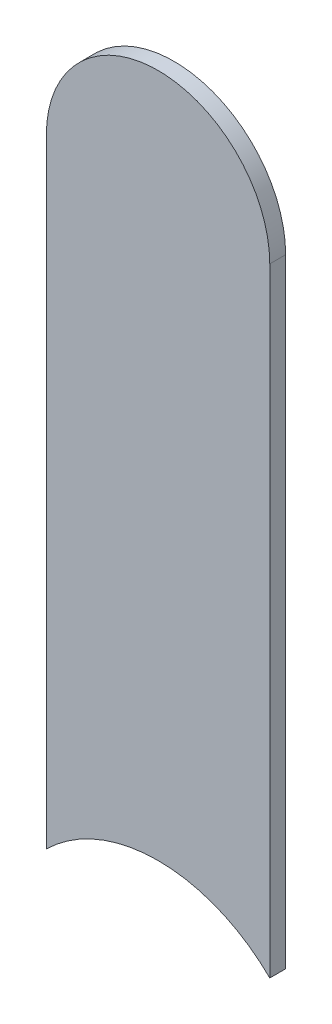
ISO-10303-21;
HEADER;
FILE_DESCRIPTION(('STEP AP214'),'2;1');
FILE_NAME('part.step','',(''),(''),'','','');
FILE_SCHEMA(('AUTOMOTIVE_DESIGN { 1 0 10303 214 1 1 1 1 }'));
ENDSEC;
DATA;
#1=APPLICATION_CONTEXT('core data for automotive mechanical design processes');
#2=APPLICATION_PROTOCOL_DEFINITION('international standard','automotive_design',2000,#1);
#3=PRODUCT_CONTEXT('',#1,'mechanical');
#4=PRODUCT('Part','Part','',(#3));
#5=PRODUCT_RELATED_PRODUCT_CATEGORY('part','',(#4));
#6=PRODUCT_DEFINITION_FORMATION('','',#4);
#7=PRODUCT_DEFINITION_CONTEXT('part definition',#1,'design');
#8=PRODUCT_DEFINITION('design','',#6,#7);
#9=PRODUCT_DEFINITION_SHAPE('','',#8);
#10=(LENGTH_UNIT() NAMED_UNIT(*) SI_UNIT(.MILLI.,.METRE.));
#11=(NAMED_UNIT(*) PLANE_ANGLE_UNIT() SI_UNIT($,.RADIAN.));
#12=(NAMED_UNIT(*) SI_UNIT($,.STERADIAN.) SOLID_ANGLE_UNIT());
#13=UNCERTAINTY_MEASURE_WITH_UNIT(LENGTH_MEASURE(1.E-05),#10,'distance_accuracy_value','');
#14=(GEOMETRIC_REPRESENTATION_CONTEXT(3) GLOBAL_UNCERTAINTY_ASSIGNED_CONTEXT((#13)) GLOBAL_UNIT_ASSIGNED_CONTEXT((#10,
#11,#12)) REPRESENTATION_CONTEXT('',''));
#15=CARTESIAN_POINT('',(0.,0.,0.));
#16=DIRECTION('',(0.,0.,1.));
#17=DIRECTION('',(1.,0.,0.));
#18=AXIS2_PLACEMENT_3D('',#15,#16,#17);
#19=CARTESIAN_POINT('',(88.14999896,112.252886075593,0.));
#20=DIRECTION('',(-1.,0.,0.));
#21=DIRECTION('',(0.,1.,0.));
#22=AXIS2_PLACEMENT_3D('',#19,#20,#21);
#23=PLANE('',#22);
#24=DIRECTION('',(0.,1.,0.));
#25=VECTOR('',#24,1.);
#26=CARTESIAN_POINT('',(88.14999896,111.99999952,0.03556));
#27=LINE('',#26,#25);
#28=CARTESIAN_POINT('',(88.14999896,112.252886075593,0.03556));
#29=VERTEX_POINT('',#28);
#30=CARTESIAN_POINT('',(88.14999896,113.63700666,0.03556));
#31=VERTEX_POINT('',#30);
#32=EDGE_CURVE('E11',#29,#31,#27,.T.);
#33=ORIENTED_EDGE('',*,*,#32,.F.);
#34=DIRECTION('',(0.,0.,1.));
#35=VECTOR('',#34,1.);
#36=CARTESIAN_POINT('',(88.14999896,112.252886075593,0.));
#37=LINE('',#36,#35);
#38=CARTESIAN_POINT('',(88.14999896,112.252886075593,0.));
#39=VERTEX_POINT('',#38);
#40=EDGE_CURVE('E24',#39,#29,#37,.T.);
#41=ORIENTED_EDGE('',*,*,#40,.F.);
#42=DIRECTION('',(0.,1.,0.));
#43=VECTOR('',#42,1.);
#44=CARTESIAN_POINT('',(88.14999896,111.99999952,0.));
#45=LINE('',#44,#43);
#46=CARTESIAN_POINT('',(88.14999896,113.63700666,0.));
#47=VERTEX_POINT('',#46);
#48=EDGE_CURVE('E75',#39,#47,#45,.T.);
#49=ORIENTED_EDGE('',*,*,#48,.T.);
#50=DIRECTION('',(0.,0.,1.));
#51=VECTOR('',#50,1.);
#52=CARTESIAN_POINT('',(88.14999896,113.63700666,0.));
#53=LINE('',#52,#51);
#54=EDGE_CURVE('E37',#47,#31,#53,.T.);
#55=ORIENTED_EDGE('',*,*,#54,.T.);
#56=EDGE_LOOP('',(#33,#41,#49,#55));
#57=FACE_BOUND('',#56,.T.);
#58=ADVANCED_FACE('F17',(#57),#23,.F.);
#59=CARTESIAN_POINT('',(87.89999946,113.63700666,0.));
#60=DIRECTION('',(0.,0.,-1.));
#61=DIRECTION('',(1.,0.,0.));
#62=AXIS2_PLACEMENT_3D('',#59,#60,#61);
#63=CYLINDRICAL_SURFACE('',#62,0.249999499999992);
#64=CARTESIAN_POINT('',(87.89999946,113.63700666,0.03556));
#65=DIRECTION('',(0.,0.,1.));
#66=DIRECTION('',(1.,0.,0.));
#67=AXIS2_PLACEMENT_3D('',#64,#65,#66);
#68=CIRCLE('',#67,0.249999499999992);
#69=CARTESIAN_POINT('',(87.64999996,113.63700666,0.03556));
#70=VERTEX_POINT('',#69);
#71=EDGE_CURVE('E83',#31,#70,#68,.T.);
#72=ORIENTED_EDGE('',*,*,#71,.F.);
#73=ORIENTED_EDGE('',*,*,#54,.F.);
#74=CARTESIAN_POINT('',(87.89999946,113.63700666,0.));
#75=DIRECTION('',(0.,0.,1.));
#76=DIRECTION('',(1.,0.,0.));
#77=AXIS2_PLACEMENT_3D('',#74,#75,#76);
#78=CIRCLE('',#77,0.249999499999992);
#79=CARTESIAN_POINT('',(87.64999996,113.63700666,0.));
#80=VERTEX_POINT('',#79);
#81=EDGE_CURVE('E81',#47,#80,#78,.T.);
#82=ORIENTED_EDGE('',*,*,#81,.T.);
#83=DIRECTION('',(0.,0.,1.));
#84=VECTOR('',#83,1.);
#85=CARTESIAN_POINT('',(87.64999996,113.63700666,0.));
#86=LINE('',#85,#84);
#87=EDGE_CURVE('E67',#80,#70,#86,.T.);
#88=ORIENTED_EDGE('',*,*,#87,.T.);
#89=EDGE_LOOP('',(#72,#73,#82,#88));
#90=FACE_BOUND('',#89,.T.);
#91=ADVANCED_FACE('F89',(#90),#63,.T.);
#92=CARTESIAN_POINT('',(87.64999996,113.63700666,0.));
#93=DIRECTION('',(1.,0.,0.));
#94=DIRECTION('',(0.,-1.,0.));
#95=AXIS2_PLACEMENT_3D('',#92,#93,#94);
#96=PLANE('',#95);
#97=DIRECTION('',(0.,-1.,0.));
#98=VECTOR('',#97,1.);
#99=CARTESIAN_POINT('',(87.64999996,113.63700666,0.03556));
#100=LINE('',#99,#98);
#101=CARTESIAN_POINT('',(87.64999996,112.252886075593,0.03556));
#102=VERTEX_POINT('',#101);
#103=EDGE_CURVE('E71',#70,#102,#100,.T.);
#104=ORIENTED_EDGE('',*,*,#103,.F.);
#105=ORIENTED_EDGE('',*,*,#87,.F.);
#106=DIRECTION('',(0.,-1.,0.));
#107=VECTOR('',#106,1.);
#108=CARTESIAN_POINT('',(87.64999996,113.63700666,0.));
#109=LINE('',#108,#107);
#110=CARTESIAN_POINT('',(87.64999996,112.252886075593,0.));
#111=VERTEX_POINT('',#110);
#112=EDGE_CURVE('E63',#80,#111,#109,.T.);
#113=ORIENTED_EDGE('',*,*,#112,.T.);
#114=DIRECTION('',(0.,0.,1.));
#115=VECTOR('',#114,1.);
#116=CARTESIAN_POINT('',(87.64999996,112.252886075593,0.));
#117=LINE('',#116,#115);
#118=EDGE_CURVE('E53',#111,#102,#117,.T.);
#119=ORIENTED_EDGE('',*,*,#118,.T.);
#120=EDGE_LOOP('',(#104,#105,#113,#119));
#121=FACE_BOUND('',#120,.T.);
#122=ADVANCED_FACE('F66',(#121),#96,.F.);
#123=CARTESIAN_POINT('',(87.89999946,111.99999952,0.));
#124=DIRECTION('',(0.,0.,-1.));
#125=DIRECTION('',(1.,0.,0.));
#126=AXIS2_PLACEMENT_3D('',#123,#124,#125);
#127=CYLINDRICAL_SURFACE('',#126,0.3556);
#128=ORIENTED_EDGE('',*,*,#40,.T.);
#129=CARTESIAN_POINT('',(87.89999946,111.99999952,0.03556));
#130=DIRECTION('',(0.,0.,1.));
#131=DIRECTION('',(1.,0.,0.));
#132=AXIS2_PLACEMENT_3D('',#129,#130,#131);
#133=CIRCLE('',#132,0.3556);
#134=EDGE_CURVE('E59',#29,#102,#133,.T.);
#135=ORIENTED_EDGE('',*,*,#134,.T.);
#136=ORIENTED_EDGE('',*,*,#118,.F.);
#137=CARTESIAN_POINT('',(87.89999946,111.99999952,0.));
#138=DIRECTION('',(0.,0.,1.));
#139=DIRECTION('',(1.,0.,0.));
#140=AXIS2_PLACEMENT_3D('',#137,#138,#139);
#141=CIRCLE('',#140,0.3556);
#142=EDGE_CURVE('E57',#39,#111,#141,.T.);
#143=ORIENTED_EDGE('',*,*,#142,.F.);
#144=EDGE_LOOP('',(#128,#135,#136,#143));
#145=FACE_BOUND('',#144,.T.);
#146=ADVANCED_FACE('F55',(#145),#127,.F.);
#147=CARTESIAN_POINT('',(88.14999896,111.99999952,0.));
#148=DIRECTION('',(0.,0.,-1.));
#149=DIRECTION('',(-1.,0.,0.));
#150=AXIS2_PLACEMENT_3D('',#147,#148,#149);
#151=PLANE('',#150);
#152=ORIENTED_EDGE('',*,*,#48,.F.);
#153=ORIENTED_EDGE('',*,*,#142,.T.);
#154=ORIENTED_EDGE('',*,*,#112,.F.);
#155=ORIENTED_EDGE('',*,*,#81,.F.);
#156=EDGE_LOOP('',(#152,#153,#154,#155));
#157=FACE_BOUND('',#156,.T.);
#158=ADVANCED_FACE('F74',(#157),#151,.T.);
#159=CARTESIAN_POINT('',(88.14999896,111.99999952,0.03556));
#160=DIRECTION('',(0.,0.,-1.));
#161=DIRECTION('',(-1.,0.,0.));
#162=AXIS2_PLACEMENT_3D('',#159,#160,#161);
#163=PLANE('',#162);
#164=ORIENTED_EDGE('',*,*,#134,.F.);
#165=ORIENTED_EDGE('',*,*,#32,.T.);
#166=ORIENTED_EDGE('',*,*,#71,.T.);
#167=ORIENTED_EDGE('',*,*,#103,.T.);
#168=EDGE_LOOP('',(#164,#165,#166,#167));
#169=FACE_BOUND('',#168,.T.);
#170=ADVANCED_FACE('F91',(#169),#163,.F.);
#171=CLOSED_SHELL('',(#58,#91,#122,#146,#158,#170));
#172=MANIFOLD_SOLID_BREP('B1',#171);
#173=ADVANCED_BREP_SHAPE_REPRESENTATION('',(#18,#172),#14);
#174=SHAPE_DEFINITION_REPRESENTATION(#9,#173);
ENDSEC;
END-ISO-10303-21;
